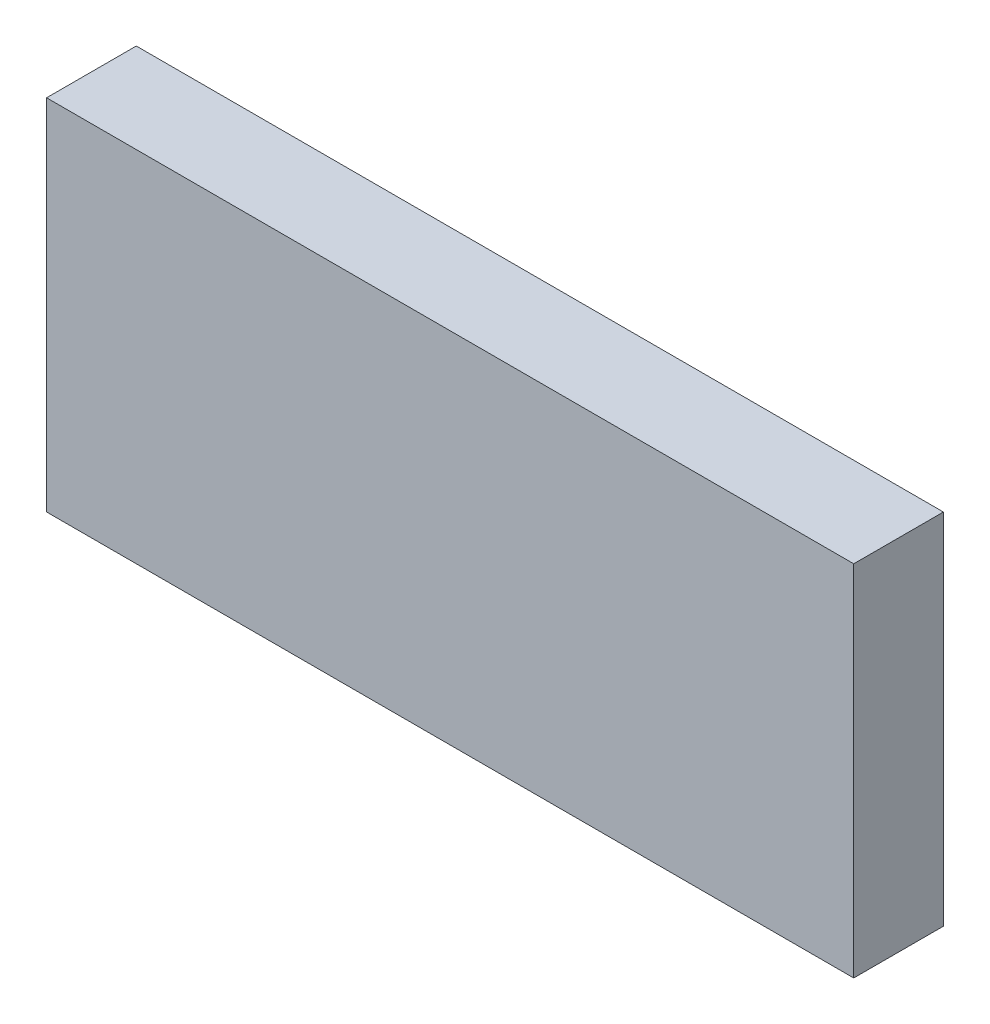
ISO-10303-21;
HEADER;
FILE_DESCRIPTION(('STEP AP214'),'2;1');
FILE_NAME('part.step','',(''),(''),'','','');
FILE_SCHEMA(('AUTOMOTIVE_DESIGN { 1 0 10303 214 1 1 1 1 }'));
ENDSEC;
DATA;
#1=APPLICATION_CONTEXT('core data for automotive mechanical design processes');
#2=APPLICATION_PROTOCOL_DEFINITION('international standard','automotive_design',2000,#1);
#3=PRODUCT_CONTEXT('',#1,'mechanical');
#4=PRODUCT('Part','Part','',(#3));
#5=PRODUCT_RELATED_PRODUCT_CATEGORY('part','',(#4));
#6=PRODUCT_DEFINITION_FORMATION('','',#4);
#7=PRODUCT_DEFINITION_CONTEXT('part definition',#1,'design');
#8=PRODUCT_DEFINITION('design','',#6,#7);
#9=PRODUCT_DEFINITION_SHAPE('','',#8);
#10=(LENGTH_UNIT() NAMED_UNIT(*) SI_UNIT(.MILLI.,.METRE.));
#11=(NAMED_UNIT(*) PLANE_ANGLE_UNIT() SI_UNIT($,.RADIAN.));
#12=(NAMED_UNIT(*) SI_UNIT($,.STERADIAN.) SOLID_ANGLE_UNIT());
#13=UNCERTAINTY_MEASURE_WITH_UNIT(LENGTH_MEASURE(1.E-05),#10,'distance_accuracy_value','');
#14=(GEOMETRIC_REPRESENTATION_CONTEXT(3) GLOBAL_UNCERTAINTY_ASSIGNED_CONTEXT((#13)) GLOBAL_UNIT_ASSIGNED_CONTEXT((#10,
#11,#12)) REPRESENTATION_CONTEXT('',''));
#15=CARTESIAN_POINT('',(0.,0.,0.));
#16=DIRECTION('',(0.,0.,1.));
#17=DIRECTION('',(1.,0.,0.));
#18=AXIS2_PLACEMENT_3D('',#15,#16,#17);
#19=CARTESIAN_POINT('',(42.8625,19.05,9.525));
#20=DIRECTION('',(-1.,0.,0.));
#21=DIRECTION('',(0.,-1.,0.));
#22=AXIS2_PLACEMENT_3D('',#19,#20,#21);
#23=PLANE('',#22);
#24=DIRECTION('',(0.,1.,0.));
#25=VECTOR('',#24,1.);
#26=CARTESIAN_POINT('',(42.8625,19.05,0.));
#27=LINE('',#26,#25);
#28=CARTESIAN_POINT('',(42.8625,-19.05,0.));
#29=VERTEX_POINT('',#28);
#30=CARTESIAN_POINT('',(42.8625,19.05,0.));
#31=VERTEX_POINT('',#30);
#32=EDGE_CURVE('E96',#29,#31,#27,.T.);
#33=ORIENTED_EDGE('',*,*,#32,.T.);
#34=DIRECTION('',(0.,0.,-1.));
#35=VECTOR('',#34,1.);
#36=CARTESIAN_POINT('',(42.8625,19.05,9.525));
#37=LINE('',#36,#35);
#38=CARTESIAN_POINT('',(42.8625,19.05,9.525));
#39=VERTEX_POINT('',#38);
#40=EDGE_CURVE('E11',#39,#31,#37,.T.);
#41=ORIENTED_EDGE('',*,*,#40,.F.);
#42=DIRECTION('',(0.,1.,0.));
#43=VECTOR('',#42,1.);
#44=CARTESIAN_POINT('',(42.8625,19.05,9.525));
#45=LINE('',#44,#43);
#46=CARTESIAN_POINT('',(42.8625,-19.05,9.525));
#47=VERTEX_POINT('',#46);
#48=EDGE_CURVE('E84',#47,#39,#45,.T.);
#49=ORIENTED_EDGE('',*,*,#48,.F.);
#50=DIRECTION('',(0.,0.,-1.));
#51=VECTOR('',#50,1.);
#52=CARTESIAN_POINT('',(42.8625,-19.05,9.525));
#53=LINE('',#52,#51);
#54=EDGE_CURVE('E92',#47,#29,#53,.T.);
#55=ORIENTED_EDGE('',*,*,#54,.T.);
#56=EDGE_LOOP('',(#33,#41,#49,#55));
#57=FACE_BOUND('',#56,.T.);
#58=ADVANCED_FACE('F33',(#57),#23,.F.);
#59=CARTESIAN_POINT('',(-42.8625,19.05,9.525));
#60=DIRECTION('',(0.,-1.,0.));
#61=DIRECTION('',(0.,0.,-1.));
#62=AXIS2_PLACEMENT_3D('',#59,#60,#61);
#63=PLANE('',#62);
#64=DIRECTION('',(-1.,0.,0.));
#65=VECTOR('',#64,1.);
#66=CARTESIAN_POINT('',(-42.8625,19.05,0.));
#67=LINE('',#66,#65);
#68=CARTESIAN_POINT('',(-42.8625,19.05,0.));
#69=VERTEX_POINT('',#68);
#70=EDGE_CURVE('E88',#31,#69,#67,.T.);
#71=ORIENTED_EDGE('',*,*,#70,.T.);
#72=DIRECTION('',(0.,0.,-1.));
#73=VECTOR('',#72,1.);
#74=CARTESIAN_POINT('',(-42.8625,19.05,9.525));
#75=LINE('',#74,#73);
#76=CARTESIAN_POINT('',(-42.8625,19.05,9.525));
#77=VERTEX_POINT('',#76);
#78=EDGE_CURVE('E41',#77,#69,#75,.T.);
#79=ORIENTED_EDGE('',*,*,#78,.F.);
#80=DIRECTION('',(-1.,0.,0.));
#81=VECTOR('',#80,1.);
#82=CARTESIAN_POINT('',(-42.8625,19.05,9.525));
#83=LINE('',#82,#81);
#84=EDGE_CURVE('E79',#39,#77,#83,.T.);
#85=ORIENTED_EDGE('',*,*,#84,.F.);
#86=ORIENTED_EDGE('',*,*,#40,.T.);
#87=EDGE_LOOP('',(#71,#79,#85,#86));
#88=FACE_BOUND('',#87,.T.);
#89=ADVANCED_FACE('F87',(#88),#63,.F.);
#90=CARTESIAN_POINT('',(-42.8625,19.05,9.525));
#91=DIRECTION('',(1.,0.,0.));
#92=DIRECTION('',(0.,1.,0.));
#93=AXIS2_PLACEMENT_3D('',#90,#91,#92);
#94=PLANE('',#93);
#95=DIRECTION('',(0.,-1.,0.));
#96=VECTOR('',#95,1.);
#97=CARTESIAN_POINT('',(-42.8625,19.05,0.));
#98=LINE('',#97,#96);
#99=CARTESIAN_POINT('',(-42.8625,-19.05,0.));
#100=VERTEX_POINT('',#99);
#101=EDGE_CURVE('E66',#69,#100,#98,.T.);
#102=ORIENTED_EDGE('',*,*,#101,.T.);
#103=DIRECTION('',(0.,0.,-1.));
#104=VECTOR('',#103,1.);
#105=CARTESIAN_POINT('',(-42.8625,-19.05,9.525));
#106=LINE('',#105,#104);
#107=CARTESIAN_POINT('',(-42.8625,-19.05,9.525));
#108=VERTEX_POINT('',#107);
#109=EDGE_CURVE('E89',#108,#100,#106,.T.);
#110=ORIENTED_EDGE('',*,*,#109,.F.);
#111=DIRECTION('',(0.,-1.,0.));
#112=VECTOR('',#111,1.);
#113=CARTESIAN_POINT('',(-42.8625,19.05,9.525));
#114=LINE('',#113,#112);
#115=EDGE_CURVE('E82',#77,#108,#114,.T.);
#116=ORIENTED_EDGE('',*,*,#115,.F.);
#117=ORIENTED_EDGE('',*,*,#78,.T.);
#118=EDGE_LOOP('',(#102,#110,#116,#117));
#119=FACE_BOUND('',#118,.T.);
#120=ADVANCED_FACE('F90',(#119),#94,.F.);
#121=CARTESIAN_POINT('',(-42.8625,-19.05,9.525));
#122=DIRECTION('',(0.,1.,0.));
#123=DIRECTION('',(0.,0.,1.));
#124=AXIS2_PLACEMENT_3D('',#121,#122,#123);
#125=PLANE('',#124);
#126=DIRECTION('',(1.,0.,0.));
#127=VECTOR('',#126,1.);
#128=CARTESIAN_POINT('',(-42.8625,-19.05,0.));
#129=LINE('',#128,#127);
#130=EDGE_CURVE('E72',#100,#29,#129,.T.);
#131=ORIENTED_EDGE('',*,*,#130,.T.);
#132=ORIENTED_EDGE('',*,*,#54,.F.);
#133=DIRECTION('',(1.,0.,0.));
#134=VECTOR('',#133,1.);
#135=CARTESIAN_POINT('',(-42.8625,-19.05,9.525));
#136=LINE('',#135,#134);
#137=EDGE_CURVE('E49',#108,#47,#136,.T.);
#138=ORIENTED_EDGE('',*,*,#137,.F.);
#139=ORIENTED_EDGE('',*,*,#109,.T.);
#140=EDGE_LOOP('',(#131,#132,#138,#139));
#141=FACE_BOUND('',#140,.T.);
#142=ADVANCED_FACE('F103',(#141),#125,.F.);
#143=CARTESIAN_POINT('',(0.,0.,9.525));
#144=DIRECTION('',(0.,0.,1.));
#145=DIRECTION('',(1.,0.,0.));
#146=AXIS2_PLACEMENT_3D('',#143,#144,#145);
#147=PLANE('',#146);
#148=ORIENTED_EDGE('',*,*,#48,.T.);
#149=ORIENTED_EDGE('',*,*,#84,.T.);
#150=ORIENTED_EDGE('',*,*,#115,.T.);
#151=ORIENTED_EDGE('',*,*,#137,.T.);
#152=EDGE_LOOP('',(#148,#149,#150,#151));
#153=FACE_BOUND('',#152,.T.);
#154=ADVANCED_FACE('F80',(#153),#147,.T.);
#155=CARTESIAN_POINT('',(0.,0.,0.));
#156=DIRECTION('',(0.,0.,1.));
#157=DIRECTION('',(1.,0.,0.));
#158=AXIS2_PLACEMENT_3D('',#155,#156,#157);
#159=PLANE('',#158);
#160=ORIENTED_EDGE('',*,*,#32,.F.);
#161=ORIENTED_EDGE('',*,*,#130,.F.);
#162=ORIENTED_EDGE('',*,*,#101,.F.);
#163=ORIENTED_EDGE('',*,*,#70,.F.);
#164=EDGE_LOOP('',(#160,#161,#162,#163));
#165=FACE_BOUND('',#164,.T.);
#166=ADVANCED_FACE('F106',(#165),#159,.F.);
#167=CLOSED_SHELL('',(#58,#89,#120,#142,#154,#166));
#168=MANIFOLD_SOLID_BREP('B2',#167);
#169=ADVANCED_BREP_SHAPE_REPRESENTATION('',(#18,#168),#14);
#170=SHAPE_DEFINITION_REPRESENTATION(#9,#169);
ENDSEC;
END-ISO-10303-21;
